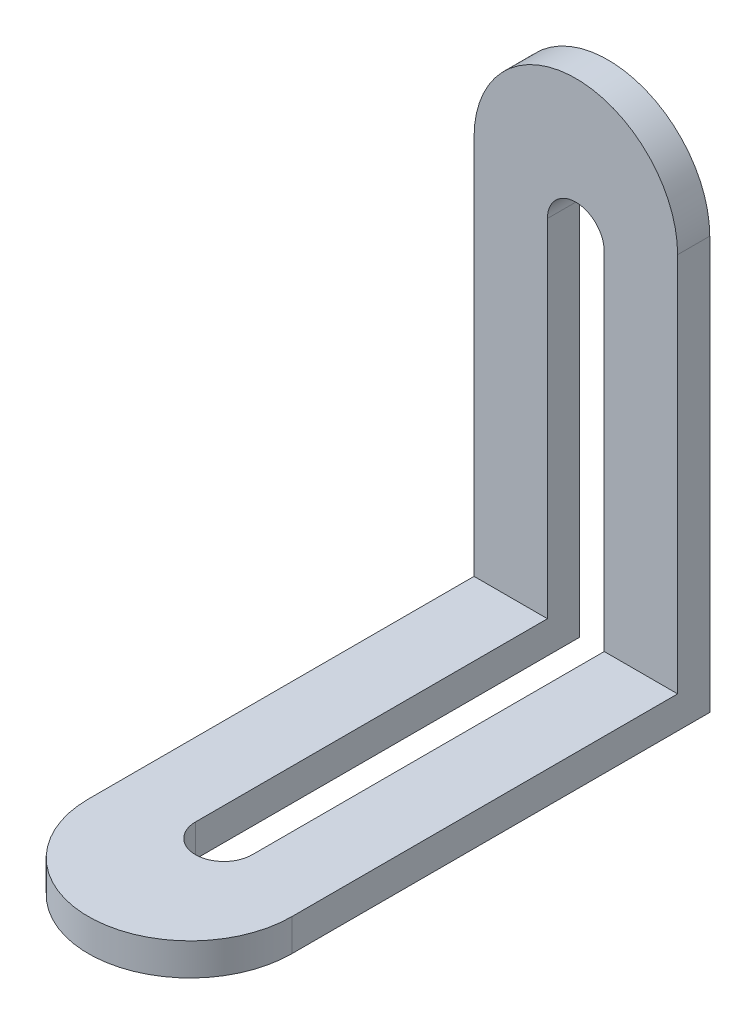
ISO-10303-21;
HEADER;
FILE_DESCRIPTION(('STEP AP214'),'2;1');
FILE_NAME('part.step','',(''),(''),'','','');
FILE_SCHEMA(('AUTOMOTIVE_DESIGN { 1 0 10303 214 1 1 1 1 }'));
ENDSEC;
DATA;
#1=APPLICATION_CONTEXT('core data for automotive mechanical design processes');
#2=APPLICATION_PROTOCOL_DEFINITION('international standard','automotive_design',2000,#1);
#3=PRODUCT_CONTEXT('',#1,'mechanical');
#4=PRODUCT('Part','Part','',(#3));
#5=PRODUCT_RELATED_PRODUCT_CATEGORY('part','',(#4));
#6=PRODUCT_DEFINITION_FORMATION('','',#4);
#7=PRODUCT_DEFINITION_CONTEXT('part definition',#1,'design');
#8=PRODUCT_DEFINITION('design','',#6,#7);
#9=PRODUCT_DEFINITION_SHAPE('','',#8);
#10=(LENGTH_UNIT() NAMED_UNIT(*) SI_UNIT(.MILLI.,.METRE.));
#11=(NAMED_UNIT(*) PLANE_ANGLE_UNIT() SI_UNIT($,.RADIAN.));
#12=(NAMED_UNIT(*) SI_UNIT($,.STERADIAN.) SOLID_ANGLE_UNIT());
#13=UNCERTAINTY_MEASURE_WITH_UNIT(LENGTH_MEASURE(1.E-05),#10,'distance_accuracy_value','');
#14=(GEOMETRIC_REPRESENTATION_CONTEXT(3) GLOBAL_UNCERTAINTY_ASSIGNED_CONTEXT((#13)) GLOBAL_UNIT_ASSIGNED_CONTEXT((#10,
#11,#12)) REPRESENTATION_CONTEXT('',''));
#15=CARTESIAN_POINT('',(0.,0.,0.));
#16=DIRECTION('',(0.,0.,1.));
#17=DIRECTION('',(1.,0.,0.));
#18=AXIS2_PLACEMENT_3D('',#15,#16,#17);
#19=CARTESIAN_POINT('',(0.,0.,0.));
#20=DIRECTION('',(0.,0.,1.));
#21=DIRECTION('',(1.,0.,0.));
#22=AXIS2_PLACEMENT_3D('',#19,#20,#21);
#23=PLANE('',#22);
#24=DIRECTION('',(0.,-1.,0.));
#25=VECTOR('',#24,1.);
#26=CARTESIAN_POINT('',(-36.3066936721177,0.,0.));
#27=LINE('',#26,#25);
#28=CARTESIAN_POINT('',(-36.3066936721177,14.9072847682119,0.));
#29=VERTEX_POINT('',#28);
#30=CARTESIAN_POINT('',(-36.3066936721177,-20.5927152317881,0.));
#31=VERTEX_POINT('',#30);
#32=EDGE_CURVE('E58',#29,#31,#27,.T.);
#33=ORIENTED_EDGE('',*,*,#32,.T.);
#34=DIRECTION('',(-1.,0.,0.));
#35=VECTOR('',#34,1.);
#36=CARTESIAN_POINT('',(0.,-20.5927152317881,0.));
#37=LINE('',#36,#35);
#38=CARTESIAN_POINT('',(-29.4566936721177,-20.5927152317881,0.));
#39=VERTEX_POINT('',#38);
#40=EDGE_CURVE('E53',#39,#31,#37,.T.);
#41=ORIENTED_EDGE('',*,*,#40,.F.);
#42=DIRECTION('',(0.,-1.,0.));
#43=VECTOR('',#42,1.);
#44=CARTESIAN_POINT('',(-29.4566936721177,0.,0.));
#45=LINE('',#44,#43);
#46=CARTESIAN_POINT('',(-29.4566936721177,11.7572847682119,0.));
#47=VERTEX_POINT('',#46);
#48=EDGE_CURVE('E178',#47,#39,#45,.T.);
#49=ORIENTED_EDGE('',*,*,#48,.F.);
#50=CARTESIAN_POINT('',(-26.8066936721177,11.7572847682119,0.));
#51=DIRECTION('',(0.,0.,1.));
#52=DIRECTION('',(1.,0.,0.));
#53=AXIS2_PLACEMENT_3D('',#50,#51,#52);
#54=CIRCLE('',#53,2.65);
#55=CARTESIAN_POINT('',(-24.1566936721177,11.7572847682119,0.));
#56=VERTEX_POINT('',#55);
#57=EDGE_CURVE('E168',#56,#47,#54,.T.);
#58=ORIENTED_EDGE('',*,*,#57,.F.);
#59=DIRECTION('',(0.,-1.,0.));
#60=VECTOR('',#59,1.);
#61=CARTESIAN_POINT('',(-24.1566936721177,0.,0.));
#62=LINE('',#61,#60);
#63=CARTESIAN_POINT('',(-24.1566936721177,-20.5927152317881,0.));
#64=VERTEX_POINT('',#63);
#65=EDGE_CURVE('E199',#56,#64,#62,.T.);
#66=ORIENTED_EDGE('',*,*,#65,.T.);
#67=DIRECTION('',(1.,0.,0.));
#68=VECTOR('',#67,1.);
#69=CARTESIAN_POINT('',(0.,-20.5927152317881,0.));
#70=LINE('',#69,#68);
#71=CARTESIAN_POINT('',(-17.3066936721177,-20.5927152317881,0.));
#72=VERTEX_POINT('',#71);
#73=EDGE_CURVE('E11',#64,#72,#70,.T.);
#74=ORIENTED_EDGE('',*,*,#73,.T.);
#75=DIRECTION('',(0.,-1.,0.));
#76=VECTOR('',#75,1.);
#77=CARTESIAN_POINT('',(-17.3066936721177,0.,0.));
#78=LINE('',#77,#76);
#79=CARTESIAN_POINT('',(-17.3066936721177,14.9072847682119,0.));
#80=VERTEX_POINT('',#79);
#81=EDGE_CURVE('E201',#80,#72,#78,.T.);
#82=ORIENTED_EDGE('',*,*,#81,.F.);
#83=CARTESIAN_POINT('',(-26.8066936721177,14.9072847682119,0.));
#84=DIRECTION('',(0.,0.,1.));
#85=DIRECTION('',(1.,0.,0.));
#86=AXIS2_PLACEMENT_3D('',#83,#84,#85);
#87=CIRCLE('',#86,9.5);
#88=EDGE_CURVE('E204',#80,#29,#87,.T.);
#89=ORIENTED_EDGE('',*,*,#88,.T.);
#90=EDGE_LOOP('',(#33,#41,#49,#58,#66,#74,#82,#89));
#91=FACE_BOUND('',#90,.T.);
#92=ADVANCED_FACE('F38',(#91),#23,.T.);
#93=CARTESIAN_POINT('',(-26.8066936721177,11.7572847682119,-3.));
#94=DIRECTION('',(0.,0.,1.));
#95=DIRECTION('',(1.,0.,0.));
#96=AXIS2_PLACEMENT_3D('',#93,#94,#95);
#97=CYLINDRICAL_SURFACE('',#96,2.65);
#98=ORIENTED_EDGE('',*,*,#57,.T.);
#99=DIRECTION('',(0.,0.,1.));
#100=VECTOR('',#99,1.);
#101=CARTESIAN_POINT('',(-29.4566936721177,11.7572847682119,-3.));
#102=LINE('',#101,#100);
#103=CARTESIAN_POINT('',(-29.4566936721177,11.7572847682119,-3.));
#104=VERTEX_POINT('',#103);
#105=EDGE_CURVE('E46',#104,#47,#102,.T.);
#106=ORIENTED_EDGE('',*,*,#105,.F.);
#107=CARTESIAN_POINT('',(-26.8066936721177,11.7572847682119,-3.));
#108=DIRECTION('',(0.,0.,1.));
#109=DIRECTION('',(1.,0.,0.));
#110=AXIS2_PLACEMENT_3D('',#107,#108,#109);
#111=CIRCLE('',#110,2.65);
#112=CARTESIAN_POINT('',(-24.1566936721177,11.7572847682119,-3.));
#113=VERTEX_POINT('',#112);
#114=EDGE_CURVE('E174',#113,#104,#111,.T.);
#115=ORIENTED_EDGE('',*,*,#114,.F.);
#116=DIRECTION('',(0.,0.,1.));
#117=VECTOR('',#116,1.);
#118=CARTESIAN_POINT('',(-24.1566936721177,11.7572847682119,-3.));
#119=LINE('',#118,#117);
#120=EDGE_CURVE('E196',#113,#56,#119,.T.);
#121=ORIENTED_EDGE('',*,*,#120,.T.);
#122=EDGE_LOOP('',(#98,#106,#115,#121));
#123=FACE_BOUND('',#122,.T.);
#124=ADVANCED_FACE('F40',(#123),#97,.F.);
#125=CARTESIAN_POINT('',(-29.4566936721177,0.,-3.));
#126=DIRECTION('',(-1.,0.,0.));
#127=DIRECTION('',(0.,-1.,0.));
#128=AXIS2_PLACEMENT_3D('',#125,#126,#127);
#129=PLANE('',#128);
#130=ORIENTED_EDGE('',*,*,#48,.T.);
#131=DIRECTION('',(0.,0.,-1.));
#132=VECTOR('',#131,1.);
#133=CARTESIAN_POINT('',(-29.4566936721177,-20.5927152317881,0.));
#134=LINE('',#133,#132);
#135=CARTESIAN_POINT('',(-29.4566936721177,-20.5927152317881,32.85));
#136=VERTEX_POINT('',#135);
#137=EDGE_CURVE('E137',#136,#39,#134,.T.);
#138=ORIENTED_EDGE('',*,*,#137,.F.);
#139=DIRECTION('',(0.,-1.,0.));
#140=VECTOR('',#139,1.);
#141=CARTESIAN_POINT('',(-29.4566936721177,-20.5927152317881,32.85));
#142=LINE('',#141,#140);
#143=CARTESIAN_POINT('',(-29.4566936721177,-23.5927152317881,32.85));
#144=VERTEX_POINT('',#143);
#145=EDGE_CURVE('E144',#136,#144,#142,.T.);
#146=ORIENTED_EDGE('',*,*,#145,.T.);
#147=DIRECTION('',(0.,0.,1.));
#148=VECTOR('',#147,1.);
#149=CARTESIAN_POINT('',(-29.4566936721177,-23.5927152317881,-3.));
#150=LINE('',#149,#148);
#151=CARTESIAN_POINT('',(-29.4566936721177,-23.5927152317881,-3.));
#152=VERTEX_POINT('',#151);
#153=EDGE_CURVE('E210',#152,#144,#150,.T.);
#154=ORIENTED_EDGE('',*,*,#153,.F.);
#155=DIRECTION('',(0.,-1.,0.));
#156=VECTOR('',#155,1.);
#157=CARTESIAN_POINT('',(-29.4566936721177,0.,-3.));
#158=LINE('',#157,#156);
#159=EDGE_CURVE('E194',#104,#152,#158,.T.);
#160=ORIENTED_EDGE('',*,*,#159,.F.);
#161=ORIENTED_EDGE('',*,*,#105,.T.);
#162=EDGE_LOOP('',(#130,#138,#146,#154,#160,#161));
#163=FACE_BOUND('',#162,.T.);
#164=ADVANCED_FACE('F226',(#163),#129,.F.);
#165=CARTESIAN_POINT('',(0.,-23.5927152317881,-3.));
#166=DIRECTION('',(0.,-1.,0.));
#167=DIRECTION('',(0.,0.,-1.));
#168=AXIS2_PLACEMENT_3D('',#165,#166,#167);
#169=PLANE('',#168);
#170=ORIENTED_EDGE('',*,*,#153,.T.);
#171=CARTESIAN_POINT('',(-26.8066936721177,-23.5927152317881,32.85));
#172=DIRECTION('',(0.,-1.,0.));
#173=DIRECTION('',(0.,0.,-1.));
#174=AXIS2_PLACEMENT_3D('',#171,#172,#173);
#175=CIRCLE('',#174,2.65);
#176=CARTESIAN_POINT('',(-24.1566936721177,-23.5927152317881,32.85));
#177=VERTEX_POINT('',#176);
#178=EDGE_CURVE('E163',#177,#144,#175,.T.);
#179=ORIENTED_EDGE('',*,*,#178,.F.);
#180=DIRECTION('',(0.,0.,1.));
#181=VECTOR('',#180,1.);
#182=CARTESIAN_POINT('',(-24.1566936721177,-23.5927152317881,-3.));
#183=LINE('',#182,#181);
#184=CARTESIAN_POINT('',(-24.1566936721177,-23.5927152317881,-3.));
#185=VERTEX_POINT('',#184);
#186=EDGE_CURVE('E132',#185,#177,#183,.T.);
#187=ORIENTED_EDGE('',*,*,#186,.F.);
#188=DIRECTION('',(1.,0.,0.));
#189=VECTOR('',#188,1.);
#190=CARTESIAN_POINT('',(0.,-23.5927152317881,-3.));
#191=LINE('',#190,#189);
#192=CARTESIAN_POINT('',(-17.3066936721177,-23.5927152317881,-3.));
#193=VERTEX_POINT('',#192);
#194=EDGE_CURVE('E180',#185,#193,#191,.T.);
#195=ORIENTED_EDGE('',*,*,#194,.T.);
#196=DIRECTION('',(0.,0.,1.));
#197=VECTOR('',#196,1.);
#198=CARTESIAN_POINT('',(-17.3066936721177,-23.5927152317881,-3.));
#199=LINE('',#198,#197);
#200=CARTESIAN_POINT('',(-17.3066936721177,-23.5927152317881,36.));
#201=VERTEX_POINT('',#200);
#202=EDGE_CURVE('E218',#193,#201,#199,.T.);
#203=ORIENTED_EDGE('',*,*,#202,.T.);
#204=CARTESIAN_POINT('',(-26.8066936721177,-23.5927152317881,36.));
#205=DIRECTION('',(0.,-1.,0.));
#206=DIRECTION('',(0.,0.,-1.));
#207=AXIS2_PLACEMENT_3D('',#204,#205,#206);
#208=CIRCLE('',#207,9.5);
#209=CARTESIAN_POINT('',(-36.3066936721177,-23.5927152317881,36.));
#210=VERTEX_POINT('',#209);
#211=EDGE_CURVE('E147',#201,#210,#208,.T.);
#212=ORIENTED_EDGE('',*,*,#211,.T.);
#213=DIRECTION('',(0.,0.,1.));
#214=VECTOR('',#213,1.);
#215=CARTESIAN_POINT('',(-36.3066936721177,-23.5927152317881,-3.));
#216=LINE('',#215,#214);
#217=CARTESIAN_POINT('',(-36.3066936721177,-23.5927152317881,-3.));
#218=VERTEX_POINT('',#217);
#219=EDGE_CURVE('E212',#218,#210,#216,.T.);
#220=ORIENTED_EDGE('',*,*,#219,.F.);
#221=DIRECTION('',(1.,0.,0.));
#222=VECTOR('',#221,1.);
#223=CARTESIAN_POINT('',(0.,-23.5927152317881,-3.));
#224=LINE('',#223,#222);
#225=EDGE_CURVE('E191',#218,#152,#224,.T.);
#226=ORIENTED_EDGE('',*,*,#225,.T.);
#227=EDGE_LOOP('',(#170,#179,#187,#195,#203,#212,#220,#226));
#228=FACE_BOUND('',#227,.T.);
#229=ADVANCED_FACE('F233',(#228),#169,.T.);
#230=CARTESIAN_POINT('',(-36.3066936721177,0.,-3.));
#231=DIRECTION('',(-1.,0.,0.));
#232=DIRECTION('',(0.,-1.,0.));
#233=AXIS2_PLACEMENT_3D('',#230,#231,#232);
#234=PLANE('',#233);
#235=ORIENTED_EDGE('',*,*,#32,.F.);
#236=DIRECTION('',(0.,0.,1.));
#237=VECTOR('',#236,1.);
#238=CARTESIAN_POINT('',(-36.3066936721177,14.9072847682119,-3.));
#239=LINE('',#238,#237);
#240=CARTESIAN_POINT('',(-36.3066936721177,14.9072847682119,-3.));
#241=VERTEX_POINT('',#240);
#242=EDGE_CURVE('E214',#241,#29,#239,.T.);
#243=ORIENTED_EDGE('',*,*,#242,.F.);
#244=DIRECTION('',(0.,-1.,0.));
#245=VECTOR('',#244,1.);
#246=CARTESIAN_POINT('',(-36.3066936721177,0.,-3.));
#247=LINE('',#246,#245);
#248=EDGE_CURVE('E188',#241,#218,#247,.T.);
#249=ORIENTED_EDGE('',*,*,#248,.T.);
#250=ORIENTED_EDGE('',*,*,#219,.T.);
#251=DIRECTION('',(0.,-1.,0.));
#252=VECTOR('',#251,1.);
#253=CARTESIAN_POINT('',(-36.3066936721177,-20.5927152317881,36.));
#254=LINE('',#253,#252);
#255=CARTESIAN_POINT('',(-36.3066936721177,-20.5927152317881,36.));
#256=VERTEX_POINT('',#255);
#257=EDGE_CURVE('E169',#256,#210,#254,.T.);
#258=ORIENTED_EDGE('',*,*,#257,.F.);
#259=DIRECTION('',(0.,0.,1.));
#260=VECTOR('',#259,1.);
#261=CARTESIAN_POINT('',(-36.3066936721177,-20.5927152317881,0.));
#262=LINE('',#261,#260);
#263=EDGE_CURVE('E159',#31,#256,#262,.T.);
#264=ORIENTED_EDGE('',*,*,#263,.F.);
#265=EDGE_LOOP('',(#235,#243,#249,#250,#258,#264));
#266=FACE_BOUND('',#265,.T.);
#267=ADVANCED_FACE('F238',(#266),#234,.T.);
#268=CARTESIAN_POINT('',(-26.8066936721177,14.9072847682119,-3.));
#269=DIRECTION('',(0.,0.,1.));
#270=DIRECTION('',(1.,0.,0.));
#271=AXIS2_PLACEMENT_3D('',#268,#269,#270);
#272=CYLINDRICAL_SURFACE('',#271,9.5);
#273=ORIENTED_EDGE('',*,*,#88,.F.);
#274=DIRECTION('',(0.,0.,1.));
#275=VECTOR('',#274,1.);
#276=CARTESIAN_POINT('',(-17.3066936721177,14.9072847682119,-3.));
#277=LINE('',#276,#275);
#278=CARTESIAN_POINT('',(-17.3066936721177,14.9072847682119,-3.));
#279=VERTEX_POINT('',#278);
#280=EDGE_CURVE('E216',#279,#80,#277,.T.);
#281=ORIENTED_EDGE('',*,*,#280,.F.);
#282=CARTESIAN_POINT('',(-26.8066936721177,14.9072847682119,-3.));
#283=DIRECTION('',(0.,0.,1.));
#284=DIRECTION('',(1.,0.,0.));
#285=AXIS2_PLACEMENT_3D('',#282,#283,#284);
#286=CIRCLE('',#285,9.5);
#287=EDGE_CURVE('E185',#279,#241,#286,.T.);
#288=ORIENTED_EDGE('',*,*,#287,.T.);
#289=ORIENTED_EDGE('',*,*,#242,.T.);
#290=EDGE_LOOP('',(#273,#281,#288,#289));
#291=FACE_BOUND('',#290,.T.);
#292=ADVANCED_FACE('F250',(#291),#272,.T.);
#293=CARTESIAN_POINT('',(-17.3066936721177,0.,-3.));
#294=DIRECTION('',(-1.,0.,0.));
#295=DIRECTION('',(0.,-1.,0.));
#296=AXIS2_PLACEMENT_3D('',#293,#294,#295);
#297=PLANE('',#296);
#298=ORIENTED_EDGE('',*,*,#202,.F.);
#299=DIRECTION('',(0.,-1.,0.));
#300=VECTOR('',#299,1.);
#301=CARTESIAN_POINT('',(-17.3066936721177,0.,-3.));
#302=LINE('',#301,#300);
#303=EDGE_CURVE('E183',#279,#193,#302,.T.);
#304=ORIENTED_EDGE('',*,*,#303,.F.);
#305=ORIENTED_EDGE('',*,*,#280,.T.);
#306=ORIENTED_EDGE('',*,*,#81,.T.);
#307=DIRECTION('',(0.,0.,1.));
#308=VECTOR('',#307,1.);
#309=CARTESIAN_POINT('',(-17.3066936721177,-20.5927152317881,0.));
#310=LINE('',#309,#308);
#311=CARTESIAN_POINT('',(-17.3066936721177,-20.5927152317881,36.));
#312=VERTEX_POINT('',#311);
#313=EDGE_CURVE('E152',#72,#312,#310,.T.);
#314=ORIENTED_EDGE('',*,*,#313,.T.);
#315=DIRECTION('',(0.,-1.,0.));
#316=VECTOR('',#315,1.);
#317=CARTESIAN_POINT('',(-17.3066936721177,-20.5927152317881,36.));
#318=LINE('',#317,#316);
#319=EDGE_CURVE('E136',#312,#201,#318,.T.);
#320=ORIENTED_EDGE('',*,*,#319,.T.);
#321=EDGE_LOOP('',(#298,#304,#305,#306,#314,#320));
#322=FACE_BOUND('',#321,.T.);
#323=ADVANCED_FACE('F245',(#322),#297,.F.);
#324=CARTESIAN_POINT('',(-24.1566936721177,0.,-3.));
#325=DIRECTION('',(-1.,0.,0.));
#326=DIRECTION('',(0.,-1.,0.));
#327=AXIS2_PLACEMENT_3D('',#324,#325,#326);
#328=PLANE('',#327);
#329=DIRECTION('',(0.,0.,-1.));
#330=VECTOR('',#329,1.);
#331=CARTESIAN_POINT('',(-24.1566936721177,-20.5927152317881,0.));
#332=LINE('',#331,#330);
#333=CARTESIAN_POINT('',(-24.1566936721177,-20.5927152317881,32.85));
#334=VERTEX_POINT('',#333);
#335=EDGE_CURVE('E130',#334,#64,#332,.T.);
#336=ORIENTED_EDGE('',*,*,#335,.T.);
#337=ORIENTED_EDGE('',*,*,#65,.F.);
#338=ORIENTED_EDGE('',*,*,#120,.F.);
#339=DIRECTION('',(0.,-1.,0.));
#340=VECTOR('',#339,1.);
#341=CARTESIAN_POINT('',(-24.1566936721177,0.,-3.));
#342=LINE('',#341,#340);
#343=EDGE_CURVE('E177',#113,#185,#342,.T.);
#344=ORIENTED_EDGE('',*,*,#343,.T.);
#345=ORIENTED_EDGE('',*,*,#186,.T.);
#346=DIRECTION('',(0.,-1.,0.));
#347=VECTOR('',#346,1.);
#348=CARTESIAN_POINT('',(-24.1566936721177,-20.5927152317881,32.85));
#349=LINE('',#348,#347);
#350=EDGE_CURVE('E125',#334,#177,#349,.T.);
#351=ORIENTED_EDGE('',*,*,#350,.F.);
#352=EDGE_LOOP('',(#336,#337,#338,#344,#345,#351));
#353=FACE_BOUND('',#352,.T.);
#354=ADVANCED_FACE('F127',(#353),#328,.T.);
#355=CARTESIAN_POINT('',(0.,0.,-3.));
#356=DIRECTION('',(0.,0.,1.));
#357=DIRECTION('',(1.,0.,0.));
#358=AXIS2_PLACEMENT_3D('',#355,#356,#357);
#359=PLANE('',#358);
#360=ORIENTED_EDGE('',*,*,#194,.F.);
#361=ORIENTED_EDGE('',*,*,#343,.F.);
#362=ORIENTED_EDGE('',*,*,#114,.T.);
#363=ORIENTED_EDGE('',*,*,#159,.T.);
#364=ORIENTED_EDGE('',*,*,#225,.F.);
#365=ORIENTED_EDGE('',*,*,#248,.F.);
#366=ORIENTED_EDGE('',*,*,#287,.F.);
#367=ORIENTED_EDGE('',*,*,#303,.T.);
#368=EDGE_LOOP('',(#360,#361,#362,#363,#364,#365,#366,#367));
#369=FACE_BOUND('',#368,.T.);
#370=ADVANCED_FACE('F231',(#369),#359,.F.);
#371=CARTESIAN_POINT('',(-26.8066936721177,-20.5927152317881,32.85));
#372=DIRECTION('',(0.,-1.,0.));
#373=DIRECTION('',(0.,0.,-1.));
#374=AXIS2_PLACEMENT_3D('',#371,#372,#373);
#375=CYLINDRICAL_SURFACE('',#374,2.65);
#376=ORIENTED_EDGE('',*,*,#178,.T.);
#377=ORIENTED_EDGE('',*,*,#145,.F.);
#378=CARTESIAN_POINT('',(-26.8066936721177,-20.5927152317881,32.85));
#379=DIRECTION('',(0.,-1.,0.));
#380=DIRECTION('',(0.,0.,-1.));
#381=AXIS2_PLACEMENT_3D('',#378,#379,#380);
#382=CIRCLE('',#381,2.65);
#383=EDGE_CURVE('E141',#334,#136,#382,.T.);
#384=ORIENTED_EDGE('',*,*,#383,.F.);
#385=ORIENTED_EDGE('',*,*,#350,.T.);
#386=EDGE_LOOP('',(#376,#377,#384,#385));
#387=FACE_BOUND('',#386,.T.);
#388=ADVANCED_FACE('F142',(#387),#375,.F.);
#389=CARTESIAN_POINT('',(-26.8066936721177,-20.5927152317881,36.));
#390=DIRECTION('',(0.,-1.,0.));
#391=DIRECTION('',(0.,0.,-1.));
#392=AXIS2_PLACEMENT_3D('',#389,#390,#391);
#393=CYLINDRICAL_SURFACE('',#392,9.5);
#394=ORIENTED_EDGE('',*,*,#211,.F.);
#395=ORIENTED_EDGE('',*,*,#319,.F.);
#396=CARTESIAN_POINT('',(-26.8066936721177,-20.5927152317881,36.));
#397=DIRECTION('',(0.,-1.,0.));
#398=DIRECTION('',(0.,0.,-1.));
#399=AXIS2_PLACEMENT_3D('',#396,#397,#398);
#400=CIRCLE('',#399,9.5);
#401=EDGE_CURVE('E154',#312,#256,#400,.T.);
#402=ORIENTED_EDGE('',*,*,#401,.T.);
#403=ORIENTED_EDGE('',*,*,#257,.T.);
#404=EDGE_LOOP('',(#394,#395,#402,#403));
#405=FACE_BOUND('',#404,.T.);
#406=ADVANCED_FACE('F242',(#405),#393,.T.);
#407=CARTESIAN_POINT('',(0.,-20.5927152317881,0.));
#408=DIRECTION('',(0.,-1.,0.));
#409=DIRECTION('',(0.,0.,-1.));
#410=AXIS2_PLACEMENT_3D('',#407,#408,#409);
#411=PLANE('',#410);
#412=ORIENTED_EDGE('',*,*,#73,.F.);
#413=ORIENTED_EDGE('',*,*,#335,.F.);
#414=ORIENTED_EDGE('',*,*,#383,.T.);
#415=ORIENTED_EDGE('',*,*,#137,.T.);
#416=ORIENTED_EDGE('',*,*,#40,.T.);
#417=ORIENTED_EDGE('',*,*,#263,.T.);
#418=ORIENTED_EDGE('',*,*,#401,.F.);
#419=ORIENTED_EDGE('',*,*,#313,.F.);
#420=EDGE_LOOP('',(#412,#413,#414,#415,#416,#417,#418,#419));
#421=FACE_BOUND('',#420,.T.);
#422=ADVANCED_FACE('F150',(#421),#411,.F.);
#423=CLOSED_SHELL('',(#92,#124,#164,#229,#267,#292,#323,#354,#370,#388,#406,#422));
#424=MANIFOLD_SOLID_BREP('B2',#423);
#425=ADVANCED_BREP_SHAPE_REPRESENTATION('',(#18,#424),#14);
#426=SHAPE_DEFINITION_REPRESENTATION(#9,#425);
ENDSEC;
END-ISO-10303-21;
